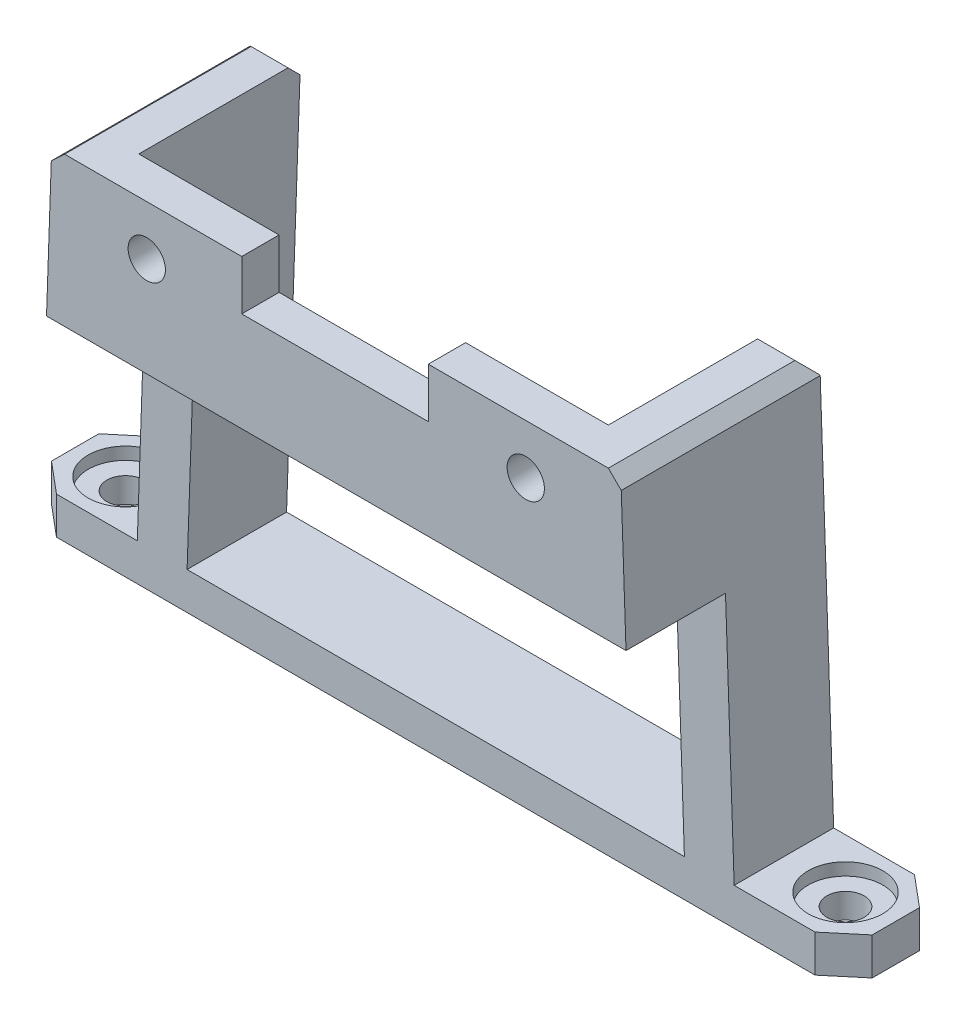
ISO-10303-21;
HEADER;
FILE_DESCRIPTION(('STEP AP214'),'2;1');
FILE_NAME('part.step','',(''),(''),'','','');
FILE_SCHEMA(('AUTOMOTIVE_DESIGN { 1 0 10303 214 1 1 1 1 }'));
ENDSEC;
DATA;
#1=APPLICATION_CONTEXT('core data for automotive mechanical design processes');
#2=APPLICATION_PROTOCOL_DEFINITION('international standard','automotive_design',2000,#1);
#3=PRODUCT_CONTEXT('',#1,'mechanical');
#4=PRODUCT('Part','Part','',(#3));
#5=PRODUCT_RELATED_PRODUCT_CATEGORY('part','',(#4));
#6=PRODUCT_DEFINITION_FORMATION('','',#4);
#7=PRODUCT_DEFINITION_CONTEXT('part definition',#1,'design');
#8=PRODUCT_DEFINITION('design','',#6,#7);
#9=PRODUCT_DEFINITION_SHAPE('','',#8);
#10=(LENGTH_UNIT() NAMED_UNIT(*) SI_UNIT(.MILLI.,.METRE.));
#11=(NAMED_UNIT(*) PLANE_ANGLE_UNIT() SI_UNIT($,.RADIAN.));
#12=(NAMED_UNIT(*) SI_UNIT($,.STERADIAN.) SOLID_ANGLE_UNIT());
#13=UNCERTAINTY_MEASURE_WITH_UNIT(LENGTH_MEASURE(1.E-05),#10,'distance_accuracy_value','');
#14=(GEOMETRIC_REPRESENTATION_CONTEXT(3) GLOBAL_UNCERTAINTY_ASSIGNED_CONTEXT((#13)) GLOBAL_UNIT_ASSIGNED_CONTEXT((#10,
#11,#12)) REPRESENTATION_CONTEXT('',''));
#15=CARTESIAN_POINT('',(0.,0.,0.));
#16=DIRECTION('',(0.,0.,1.));
#17=DIRECTION('',(1.,0.,0.));
#18=AXIS2_PLACEMENT_3D('',#15,#16,#17);
#19=CARTESIAN_POINT('',(-7.60000000000001,35.,-11.52417469626));
#20=DIRECTION('',(-1.,0.,0.));
#21=DIRECTION('',(0.,-1.,0.));
#22=AXIS2_PLACEMENT_3D('',#19,#20,#21);
#23=PLANE('',#22);
#24=DIRECTION('',(0.,-1.,0.));
#25=VECTOR('',#24,1.);
#26=CARTESIAN_POINT('',(-7.60000000000001,35.,9.));
#27=LINE('',#26,#25);
#28=CARTESIAN_POINT('',(-7.60000000000001,35.,9.));
#29=VERTEX_POINT('',#28);
#30=CARTESIAN_POINT('',(-7.6,31.,9.));
#31=VERTEX_POINT('',#30);
#32=EDGE_CURVE('E386',#29,#31,#27,.T.);
#33=ORIENTED_EDGE('',*,*,#32,.F.);
#34=DIRECTION('',(0.,0.,1.));
#35=VECTOR('',#34,1.);
#36=CARTESIAN_POINT('',(-7.60000000000001,35.,-11.52417469626));
#37=LINE('',#36,#35);
#38=CARTESIAN_POINT('',(-7.60000000000001,35.,12.));
#39=VERTEX_POINT('',#38);
#40=EDGE_CURVE('E406',#29,#39,#37,.T.);
#41=ORIENTED_EDGE('',*,*,#40,.T.);
#42=DIRECTION('',(0.,-1.,0.));
#43=VECTOR('',#42,1.);
#44=CARTESIAN_POINT('',(-7.60000000000001,35.,12.));
#45=LINE('',#44,#43);
#46=CARTESIAN_POINT('',(-7.6,31.,12.));
#47=VERTEX_POINT('',#46);
#48=EDGE_CURVE('E389',#39,#47,#45,.T.);
#49=ORIENTED_EDGE('',*,*,#48,.T.);
#50=DIRECTION('',(0.,0.,1.));
#51=VECTOR('',#50,1.);
#52=CARTESIAN_POINT('',(-7.6,31.,-11.52417469626));
#53=LINE('',#52,#51);
#54=EDGE_CURVE('E394',#31,#47,#53,.T.);
#55=ORIENTED_EDGE('',*,*,#54,.F.);
#56=EDGE_LOOP('',(#33,#41,#49,#55));
#57=FACE_BOUND('',#56,.T.);
#58=ADVANCED_FACE('F46',(#57),#23,.F.);
#59=CARTESIAN_POINT('',(-7.6,31.,-11.52417469626));
#60=DIRECTION('',(0.,-1.,0.));
#61=DIRECTION('',(1.,0.,0.));
#62=AXIS2_PLACEMENT_3D('',#59,#60,#61);
#63=PLANE('',#62);
#64=DIRECTION('',(1.,0.,0.));
#65=VECTOR('',#64,1.);
#66=CARTESIAN_POINT('',(-7.6,31.,9.));
#67=LINE('',#66,#65);
#68=CARTESIAN_POINT('',(7.4,31.,9.));
#69=VERTEX_POINT('',#68);
#70=EDGE_CURVE('E381',#31,#69,#67,.T.);
#71=ORIENTED_EDGE('',*,*,#70,.F.);
#72=ORIENTED_EDGE('',*,*,#54,.T.);
#73=DIRECTION('',(1.,0.,0.));
#74=VECTOR('',#73,1.);
#75=CARTESIAN_POINT('',(-7.6,31.,12.));
#76=LINE('',#75,#74);
#77=CARTESIAN_POINT('',(7.4,31.,12.));
#78=VERTEX_POINT('',#77);
#79=EDGE_CURVE('E395',#47,#78,#76,.T.);
#80=ORIENTED_EDGE('',*,*,#79,.T.);
#81=DIRECTION('',(0.,0.,1.));
#82=VECTOR('',#81,1.);
#83=CARTESIAN_POINT('',(7.4,31.,-11.52417469626));
#84=LINE('',#83,#82);
#85=EDGE_CURVE('E407',#69,#78,#84,.T.);
#86=ORIENTED_EDGE('',*,*,#85,.F.);
#87=EDGE_LOOP('',(#71,#72,#80,#86));
#88=FACE_BOUND('',#87,.T.);
#89=ADVANCED_FACE('F594',(#88),#63,.F.);
#90=CARTESIAN_POINT('',(7.4,31.,-11.52417469626));
#91=DIRECTION('',(1.,0.,0.));
#92=DIRECTION('',(0.,0.,-1.));
#93=AXIS2_PLACEMENT_3D('',#90,#91,#92);
#94=PLANE('',#93);
#95=DIRECTION('',(0.,1.,0.));
#96=VECTOR('',#95,1.);
#97=CARTESIAN_POINT('',(7.4,31.,9.));
#98=LINE('',#97,#96);
#99=CARTESIAN_POINT('',(7.4,35.,9.));
#100=VERTEX_POINT('',#99);
#101=EDGE_CURVE('E284',#69,#100,#98,.T.);
#102=ORIENTED_EDGE('',*,*,#101,.F.);
#103=ORIENTED_EDGE('',*,*,#85,.T.);
#104=DIRECTION('',(0.,1.,0.));
#105=VECTOR('',#104,1.);
#106=CARTESIAN_POINT('',(7.4,31.,12.));
#107=LINE('',#106,#105);
#108=CARTESIAN_POINT('',(7.4,35.,12.));
#109=VERTEX_POINT('',#108);
#110=EDGE_CURVE('E390',#78,#109,#107,.T.);
#111=ORIENTED_EDGE('',*,*,#110,.T.);
#112=DIRECTION('',(0.,0.,1.));
#113=VECTOR('',#112,1.);
#114=CARTESIAN_POINT('',(7.4,35.,-11.52417469626));
#115=LINE('',#114,#113);
#116=EDGE_CURVE('E402',#100,#109,#115,.T.);
#117=ORIENTED_EDGE('',*,*,#116,.F.);
#118=EDGE_LOOP('',(#102,#103,#111,#117));
#119=FACE_BOUND('',#118,.T.);
#120=ADVANCED_FACE('F600',(#119),#94,.F.);
#121=CARTESIAN_POINT('',(-22.8825353762642,35.,-36.4069962306133));
#122=DIRECTION('',(0.,1.,0.));
#123=DIRECTION('',(0.,0.,1.));
#124=AXIS2_PLACEMENT_3D('',#121,#122,#123);
#125=PLANE('',#124);
#126=DIRECTION('',(-1.,0.,0.));
#127=VECTOR('',#126,1.);
#128=CARTESIAN_POINT('',(-22.8825353762642,35.,-2.99999999999999));
#129=LINE('',#128,#127);
#130=CARTESIAN_POINT('',(-18.8800971990689,35.,-2.99999999999999));
#131=VERTEX_POINT('',#130);
#132=CARTESIAN_POINT('',(-21.8457194209857,35.,-2.99999999999999));
#133=VERTEX_POINT('',#132);
#134=EDGE_CURVE('E287',#131,#133,#129,.T.);
#135=ORIENTED_EDGE('',*,*,#134,.T.);
#136=DIRECTION('',(0.,0.,1.));
#137=VECTOR('',#136,1.);
#138=CARTESIAN_POINT('',(-21.8457194209857,35.,-36.4069962306133));
#139=LINE('',#138,#137);
#140=CARTESIAN_POINT('',(-21.8457194209857,35.,12.));
#141=VERTEX_POINT('',#140);
#142=EDGE_CURVE('E291',#133,#141,#139,.T.);
#143=ORIENTED_EDGE('',*,*,#142,.T.);
#144=DIRECTION('',(-1.,0.,0.));
#145=VECTOR('',#144,1.);
#146=CARTESIAN_POINT('',(-22.8825353762642,35.,12.));
#147=LINE('',#146,#145);
#148=EDGE_CURVE('E439',#39,#141,#147,.T.);
#149=ORIENTED_EDGE('',*,*,#148,.F.);
#150=ORIENTED_EDGE('',*,*,#40,.F.);
#151=DIRECTION('',(1.,0.,0.));
#152=VECTOR('',#151,1.);
#153=CARTESIAN_POINT('',(-18.8800971990689,35.,9.));
#154=LINE('',#153,#152);
#155=CARTESIAN_POINT('',(-18.8800971990689,35.,9.));
#156=VERTEX_POINT('',#155);
#157=EDGE_CURVE('E374',#156,#29,#154,.T.);
#158=ORIENTED_EDGE('',*,*,#157,.F.);
#159=DIRECTION('',(0.,0.,1.));
#160=VECTOR('',#159,1.);
#161=CARTESIAN_POINT('',(-18.8800971990689,35.,-36.4069962306133));
#162=LINE('',#161,#160);
#163=EDGE_CURVE('E496',#131,#156,#162,.T.);
#164=ORIENTED_EDGE('',*,*,#163,.F.);
#165=EDGE_LOOP('',(#135,#143,#149,#150,#158,#164));
#166=FACE_BOUND('',#165,.T.);
#167=ADVANCED_FACE('F648',(#166),#125,.T.);
#168=CARTESIAN_POINT('',(-28.953010595,3.,0.));
#169=DIRECTION('',(0.,-1.,0.));
#170=DIRECTION('',(0.,0.,-1.));
#171=AXIS2_PLACEMENT_3D('',#168,#169,#170);
#172=CYLINDRICAL_SURFACE('',#171,1.5);
#173=CARTESIAN_POINT('',(-28.953010595,0.,0.));
#174=DIRECTION('',(0.,1.,0.));
#175=DIRECTION('',(0.,0.,1.));
#176=AXIS2_PLACEMENT_3D('',#173,#174,#175);
#177=CIRCLE('',#176,1.5);
#178=CARTESIAN_POINT('',(-28.953010595,0.,1.5));
#179=VERTEX_POINT('',#178);
#180=EDGE_CURVE('E507',#179,#179,#177,.T.);
#181=ORIENTED_EDGE('',*,*,#180,.F.);
#182=EDGE_LOOP('',(#181));
#183=FACE_BOUND('',#182,.T.);
#184=CARTESIAN_POINT('',(-28.953010595,2.,0.));
#185=DIRECTION('',(0.,1.,0.));
#186=DIRECTION('',(0.,0.,1.));
#187=AXIS2_PLACEMENT_3D('',#184,#185,#186);
#188=CIRCLE('',#187,1.5);
#189=CARTESIAN_POINT('',(-28.953010595,2.,1.5));
#190=VERTEX_POINT('',#189);
#191=EDGE_CURVE('E278',#190,#190,#188,.T.);
#192=ORIENTED_EDGE('',*,*,#191,.T.);
#193=EDGE_LOOP('',(#192));
#194=FACE_BOUND('',#193,.T.);
#195=ADVANCED_FACE('F655',(#183,#194),#172,.F.);
#196=CARTESIAN_POINT('',(28.953010595,3.,0.));
#197=DIRECTION('',(0.,-1.,0.));
#198=DIRECTION('',(0.,0.,-1.));
#199=AXIS2_PLACEMENT_3D('',#196,#197,#198);
#200=CYLINDRICAL_SURFACE('',#199,1.5);
#201=CARTESIAN_POINT('',(28.953010595,0.,0.));
#202=DIRECTION('',(0.,1.,0.));
#203=DIRECTION('',(0.,0.,1.));
#204=AXIS2_PLACEMENT_3D('',#201,#202,#203);
#205=CIRCLE('',#204,1.5);
#206=CARTESIAN_POINT('',(28.953010595,0.,1.5));
#207=VERTEX_POINT('',#206);
#208=EDGE_CURVE('E503',#207,#207,#205,.T.);
#209=ORIENTED_EDGE('',*,*,#208,.F.);
#210=EDGE_LOOP('',(#209));
#211=FACE_BOUND('',#210,.T.);
#212=CARTESIAN_POINT('',(28.953010595,2.,0.));
#213=DIRECTION('',(0.,1.,0.));
#214=DIRECTION('',(0.,0.,1.));
#215=AXIS2_PLACEMENT_3D('',#212,#213,#214);
#216=CIRCLE('',#215,1.5);
#217=CARTESIAN_POINT('',(28.953010595,2.,1.5));
#218=VERTEX_POINT('',#217);
#219=EDGE_CURVE('E274',#218,#218,#216,.T.);
#220=ORIENTED_EDGE('',*,*,#219,.T.);
#221=EDGE_LOOP('',(#220));
#222=FACE_BOUND('',#221,.T.);
#223=ADVANCED_FACE('F652',(#211,#222),#200,.F.);
#224=CARTESIAN_POINT('',(-33.,3.,4.));
#225=DIRECTION('',(0.,0.,-1.));
#226=DIRECTION('',(-1.,0.,0.));
#227=AXIS2_PLACEMENT_3D('',#224,#225,#226);
#228=PLANE('',#227);
#229=DIRECTION('',(1.,0.,0.));
#230=VECTOR('',#229,1.);
#231=CARTESIAN_POINT('',(-33.,0.,4.));
#232=LINE('',#231,#230);
#233=CARTESIAN_POINT('',(-30.5,0.,4.));
#234=VERTEX_POINT('',#233);
#235=CARTESIAN_POINT('',(30.5,0.,4.));
#236=VERTEX_POINT('',#235);
#237=EDGE_CURVE('E252',#234,#236,#232,.T.);
#238=ORIENTED_EDGE('',*,*,#237,.T.);
#239=DIRECTION('',(0.,1.,0.));
#240=VECTOR('',#239,1.);
#241=CARTESIAN_POINT('',(30.5,-3.26351822333071,4.));
#242=LINE('',#241,#240);
#243=CARTESIAN_POINT('',(30.5,3.,4.));
#244=VERTEX_POINT('',#243);
#245=EDGE_CURVE('E553',#236,#244,#242,.T.);
#246=ORIENTED_EDGE('',*,*,#245,.T.);
#247=DIRECTION('',(1.,0.,0.));
#248=VECTOR('',#247,1.);
#249=CARTESIAN_POINT('',(-33.,3.,4.));
#250=LINE('',#249,#248);
#251=CARTESIAN_POINT('',(24.,3.,4.));
#252=VERTEX_POINT('',#251);
#253=EDGE_CURVE('E520',#252,#244,#250,.T.);
#254=ORIENTED_EDGE('',*,*,#253,.F.);
#255=DIRECTION('',(0.0348994967024968,-0.999390827019096,0.));
#256=VECTOR('',#255,1.);
#257=CARTESIAN_POINT('',(24.,3.,4.));
#258=LINE('',#257,#256);
#259=CARTESIAN_POINT('',(23.3015846101651,23.,4.));
#260=VERTEX_POINT('',#259);
#261=EDGE_CURVE('E454',#260,#252,#258,.T.);
#262=ORIENTED_EDGE('',*,*,#261,.F.);
#263=DIRECTION('',(1.,0.,0.));
#264=VECTOR('',#263,1.);
#265=CARTESIAN_POINT('',(23.3015846101651,23.,4.));
#266=LINE('',#265,#264);
#267=CARTESIAN_POINT('',(19.2991464329698,23.,4.));
#268=VERTEX_POINT('',#267);
#269=EDGE_CURVE('E288',#268,#260,#266,.T.);
#270=ORIENTED_EDGE('',*,*,#269,.F.);
#271=DIRECTION('',(-0.0348994967024967,0.999390827019096,0.));
#272=VECTOR('',#271,1.);
#273=CARTESIAN_POINT('',(18.8800971990689,35.,4.));
#274=LINE('',#273,#272);
#275=CARTESIAN_POINT('',(19.9975618228047,3.,4.));
#276=VERTEX_POINT('',#275);
#277=EDGE_CURVE('E462',#276,#268,#274,.T.);
#278=ORIENTED_EDGE('',*,*,#277,.F.);
#279=CARTESIAN_POINT('',(-19.9975618228047,3.,4.));
#280=VERTEX_POINT('',#279);
#281=EDGE_CURVE('E523',#280,#276,#250,.T.);
#282=ORIENTED_EDGE('',*,*,#281,.F.);
#283=DIRECTION('',(0.0348994967024967,0.999390827019096,0.));
#284=VECTOR('',#283,1.);
#285=CARTESIAN_POINT('',(-18.8800971990689,35.,4.));
#286=LINE('',#285,#284);
#287=CARTESIAN_POINT('',(-19.2991464329698,23.,4.));
#288=VERTEX_POINT('',#287);
#289=EDGE_CURVE('E458',#280,#288,#286,.T.);
#290=ORIENTED_EDGE('',*,*,#289,.T.);
#291=CARTESIAN_POINT('',(-23.3015846101651,23.,4.));
#292=VERTEX_POINT('',#291);
#293=EDGE_CURVE('E283',#292,#288,#266,.T.);
#294=ORIENTED_EDGE('',*,*,#293,.F.);
#295=DIRECTION('',(-0.0348994967024968,-0.999390827019096,0.));
#296=VECTOR('',#295,1.);
#297=CARTESIAN_POINT('',(-24.,3.,4.));
#298=LINE('',#297,#296);
#299=CARTESIAN_POINT('',(-24.,3.,4.));
#300=VERTEX_POINT('',#299);
#301=EDGE_CURVE('E489',#292,#300,#298,.T.);
#302=ORIENTED_EDGE('',*,*,#301,.T.);
#303=CARTESIAN_POINT('',(-30.5,3.,4.));
#304=VERTEX_POINT('',#303);
#305=EDGE_CURVE('E254',#304,#300,#250,.T.);
#306=ORIENTED_EDGE('',*,*,#305,.F.);
#307=DIRECTION('',(0.,1.,0.));
#308=VECTOR('',#307,1.);
#309=CARTESIAN_POINT('',(-30.5,-3.26351822333071,4.));
#310=LINE('',#309,#308);
#311=EDGE_CURVE('E236',#234,#304,#310,.T.);
#312=ORIENTED_EDGE('',*,*,#311,.F.);
#313=EDGE_LOOP('',(#238,#246,#254,#262,#270,#278,#282,#290,#294,#302,#306,#312));
#314=FACE_BOUND('',#313,.T.);
#315=ADVANCED_FACE('F250',(#314),#228,.F.);
#316=CARTESIAN_POINT('',(0.,3.,0.));
#317=DIRECTION('',(0.,-1.,0.));
#318=DIRECTION('',(0.,0.,-1.));
#319=AXIS2_PLACEMENT_3D('',#316,#317,#318);
#320=PLANE('',#319);
#321=CARTESIAN_POINT('',(28.953010595,3.,0.));
#322=DIRECTION('',(0.,1.,0.));
#323=DIRECTION('',(0.,0.,1.));
#324=AXIS2_PLACEMENT_3D('',#321,#322,#323);
#325=CIRCLE('',#324,3.);
#326=CARTESIAN_POINT('',(28.953010595,3.,3.));
#327=VERTEX_POINT('',#326);
#328=EDGE_CURVE('E422',#327,#327,#325,.T.);
#329=ORIENTED_EDGE('',*,*,#328,.F.);
#330=EDGE_LOOP('',(#329));
#331=FACE_BOUND('',#330,.T.);
#332=DIRECTION('',(0.,0.,-1.));
#333=VECTOR('',#332,1.);
#334=CARTESIAN_POINT('',(33.,3.,4.));
#335=LINE('',#334,#333);
#336=CARTESIAN_POINT('',(33.,3.,1.90225092205678));
#337=VERTEX_POINT('',#336);
#338=CARTESIAN_POINT('',(33.,3.,-1.90225092205678));
#339=VERTEX_POINT('',#338);
#340=EDGE_CURVE('E262',#337,#339,#335,.T.);
#341=ORIENTED_EDGE('',*,*,#340,.T.);
#342=DIRECTION('',(0.766044443118975,0.,0.642787609686543));
#343=VECTOR('',#342,1.);
#344=CARTESIAN_POINT('',(30.5,3.,-4.));
#345=LINE('',#344,#343);
#346=CARTESIAN_POINT('',(30.5,3.,-4.));
#347=VERTEX_POINT('',#346);
#348=EDGE_CURVE('E550',#347,#339,#345,.T.);
#349=ORIENTED_EDGE('',*,*,#348,.F.);
#350=DIRECTION('',(-1.,0.,0.));
#351=VECTOR('',#350,1.);
#352=CARTESIAN_POINT('',(-33.,3.,-4.));
#353=LINE('',#352,#351);
#354=CARTESIAN_POINT('',(24.,3.,-4.));
#355=VERTEX_POINT('',#354);
#356=EDGE_CURVE('E512',#347,#355,#353,.T.);
#357=ORIENTED_EDGE('',*,*,#356,.T.);
#358=DIRECTION('',(0.,0.,1.));
#359=VECTOR('',#358,1.);
#360=CARTESIAN_POINT('',(24.,3.,-36.4069962306133));
#361=LINE('',#360,#359);
#362=EDGE_CURVE('E466',#355,#252,#361,.T.);
#363=ORIENTED_EDGE('',*,*,#362,.T.);
#364=ORIENTED_EDGE('',*,*,#253,.T.);
#365=DIRECTION('',(-0.766044443118974,0.,0.642787609686544));
#366=VECTOR('',#365,1.);
#367=CARTESIAN_POINT('',(30.5,3.,4.));
#368=LINE('',#367,#366);
#369=EDGE_CURVE('E256',#337,#244,#368,.T.);
#370=ORIENTED_EDGE('',*,*,#369,.F.);
#371=EDGE_LOOP('',(#341,#349,#357,#363,#364,#370));
#372=FACE_BOUND('',#371,.T.);
#373=ADVANCED_FACE('F660',(#331,#372),#320,.F.);
#374=DIRECTION('',(0.,0.,1.));
#375=VECTOR('',#374,1.);
#376=CARTESIAN_POINT('',(19.9975618228047,3.,-36.4069962306133));
#377=LINE('',#376,#375);
#378=CARTESIAN_POINT('',(19.9975618228047,3.,-4.));
#379=VERTEX_POINT('',#378);
#380=EDGE_CURVE('E467',#379,#276,#377,.T.);
#381=ORIENTED_EDGE('',*,*,#380,.F.);
#382=CARTESIAN_POINT('',(-19.9975618228047,3.,-4.));
#383=VERTEX_POINT('',#382);
#384=EDGE_CURVE('E516',#379,#383,#353,.T.);
#385=ORIENTED_EDGE('',*,*,#384,.T.);
#386=DIRECTION('',(0.,0.,1.));
#387=VECTOR('',#386,1.);
#388=CARTESIAN_POINT('',(-19.9975618228047,3.,-36.4069962306133));
#389=LINE('',#388,#387);
#390=EDGE_CURVE('E492',#383,#280,#389,.T.);
#391=ORIENTED_EDGE('',*,*,#390,.T.);
#392=ORIENTED_EDGE('',*,*,#281,.T.);
#393=EDGE_LOOP('',(#381,#385,#391,#392));
#394=FACE_BOUND('',#393,.T.);
#395=ADVANCED_FACE('F663',(#394),#320,.F.);
#396=CARTESIAN_POINT('',(-28.953010595,3.,0.));
#397=DIRECTION('',(0.,1.,0.));
#398=DIRECTION('',(0.,0.,1.));
#399=AXIS2_PLACEMENT_3D('',#396,#397,#398);
#400=CIRCLE('',#399,3.);
#401=CARTESIAN_POINT('',(-28.953010595,3.,3.));
#402=VERTEX_POINT('',#401);
#403=EDGE_CURVE('E418',#402,#402,#400,.T.);
#404=ORIENTED_EDGE('',*,*,#403,.F.);
#405=EDGE_LOOP('',(#404));
#406=FACE_BOUND('',#405,.T.);
#407=DIRECTION('',(0.,0.,1.));
#408=VECTOR('',#407,1.);
#409=CARTESIAN_POINT('',(-33.,3.,4.));
#410=LINE('',#409,#408);
#411=CARTESIAN_POINT('',(-33.,3.,-1.90225092205678));
#412=VERTEX_POINT('',#411);
#413=CARTESIAN_POINT('',(-33.,3.,1.90225092205678));
#414=VERTEX_POINT('',#413);
#415=EDGE_CURVE('E515',#412,#414,#410,.T.);
#416=ORIENTED_EDGE('',*,*,#415,.T.);
#417=DIRECTION('',(-0.766044443118975,0.,-0.642787609686543));
#418=VECTOR('',#417,1.);
#419=CARTESIAN_POINT('',(-30.5,3.,4.));
#420=LINE('',#419,#418);
#421=EDGE_CURVE('E245',#304,#414,#420,.T.);
#422=ORIENTED_EDGE('',*,*,#421,.F.);
#423=ORIENTED_EDGE('',*,*,#305,.T.);
#424=DIRECTION('',(0.,0.,1.));
#425=VECTOR('',#424,1.);
#426=CARTESIAN_POINT('',(-24.,3.,-36.4069962306133));
#427=LINE('',#426,#425);
#428=CARTESIAN_POINT('',(-24.,3.,-4.));
#429=VERTEX_POINT('',#428);
#430=EDGE_CURVE('E485',#429,#300,#427,.T.);
#431=ORIENTED_EDGE('',*,*,#430,.F.);
#432=CARTESIAN_POINT('',(-30.5,3.,-4.));
#433=VERTEX_POINT('',#432);
#434=EDGE_CURVE('E268',#429,#433,#353,.T.);
#435=ORIENTED_EDGE('',*,*,#434,.T.);
#436=DIRECTION('',(0.766044443118974,0.,-0.642787609686544));
#437=VECTOR('',#436,1.);
#438=CARTESIAN_POINT('',(-30.5,3.,-4.));
#439=LINE('',#438,#437);
#440=EDGE_CURVE('E546',#412,#433,#439,.T.);
#441=ORIENTED_EDGE('',*,*,#440,.F.);
#442=EDGE_LOOP('',(#416,#422,#423,#431,#435,#441));
#443=FACE_BOUND('',#442,.T.);
#444=ADVANCED_FACE('F579',(#406,#443),#320,.F.);
#445=CARTESIAN_POINT('',(0.,0.,0.));
#446=DIRECTION('',(0.,-1.,0.));
#447=DIRECTION('',(0.,0.,-1.));
#448=AXIS2_PLACEMENT_3D('',#445,#446,#447);
#449=PLANE('',#448);
#450=DIRECTION('',(0.766044443118975,0.,0.642787609686543));
#451=VECTOR('',#450,1.);
#452=CARTESIAN_POINT('',(30.5,0.,-4.));
#453=LINE('',#452,#451);
#454=CARTESIAN_POINT('',(30.5,0.,-4.));
#455=VERTEX_POINT('',#454);
#456=CARTESIAN_POINT('',(33.,0.,-1.90225092205678));
#457=VERTEX_POINT('',#456);
#458=EDGE_CURVE('E73',#455,#457,#453,.T.);
#459=ORIENTED_EDGE('',*,*,#458,.T.);
#460=DIRECTION('',(0.,0.,-1.));
#461=VECTOR('',#460,1.);
#462=CARTESIAN_POINT('',(33.,0.,4.));
#463=LINE('',#462,#461);
#464=CARTESIAN_POINT('',(33.,0.,1.90225092205678));
#465=VERTEX_POINT('',#464);
#466=EDGE_CURVE('E510',#465,#457,#463,.T.);
#467=ORIENTED_EDGE('',*,*,#466,.F.);
#468=DIRECTION('',(-0.766044443118974,0.,0.642787609686544));
#469=VECTOR('',#468,1.);
#470=CARTESIAN_POINT('',(30.5,0.,4.));
#471=LINE('',#470,#469);
#472=EDGE_CURVE('E65',#465,#236,#471,.T.);
#473=ORIENTED_EDGE('',*,*,#472,.T.);
#474=ORIENTED_EDGE('',*,*,#237,.F.);
#475=DIRECTION('',(-0.766044443118975,0.,-0.642787609686543));
#476=VECTOR('',#475,1.);
#477=CARTESIAN_POINT('',(-30.5,0.,4.));
#478=LINE('',#477,#476);
#479=CARTESIAN_POINT('',(-33.,0.,1.90225092205678));
#480=VERTEX_POINT('',#479);
#481=EDGE_CURVE('E233',#234,#480,#478,.T.);
#482=ORIENTED_EDGE('',*,*,#481,.T.);
#483=DIRECTION('',(0.,0.,1.));
#484=VECTOR('',#483,1.);
#485=CARTESIAN_POINT('',(-33.,0.,4.));
#486=LINE('',#485,#484);
#487=CARTESIAN_POINT('',(-33.,0.,-1.90225092205678));
#488=VERTEX_POINT('',#487);
#489=EDGE_CURVE('E263',#488,#480,#486,.T.);
#490=ORIENTED_EDGE('',*,*,#489,.F.);
#491=DIRECTION('',(0.766044443118974,0.,-0.642787609686544));
#492=VECTOR('',#491,1.);
#493=CARTESIAN_POINT('',(-30.5,0.,-4.));
#494=LINE('',#493,#492);
#495=CARTESIAN_POINT('',(-30.5,0.,-4.));
#496=VERTEX_POINT('',#495);
#497=EDGE_CURVE('E537',#488,#496,#494,.T.);
#498=ORIENTED_EDGE('',*,*,#497,.T.);
#499=DIRECTION('',(-1.,0.,0.));
#500=VECTOR('',#499,1.);
#501=CARTESIAN_POINT('',(-33.,0.,-4.));
#502=LINE('',#501,#500);
#503=EDGE_CURVE('E270',#455,#496,#502,.T.);
#504=ORIENTED_EDGE('',*,*,#503,.F.);
#505=EDGE_LOOP('',(#459,#467,#473,#474,#482,#490,#498,#504));
#506=FACE_BOUND('',#505,.T.);
#507=ORIENTED_EDGE('',*,*,#180,.T.);
#508=EDGE_LOOP('',(#507));
#509=FACE_BOUND('',#508,.T.);
#510=ORIENTED_EDGE('',*,*,#208,.T.);
#511=EDGE_LOOP('',(#510));
#512=FACE_BOUND('',#511,.T.);
#513=ADVANCED_FACE('F258',(#506,#509,#512),#449,.T.);
#514=CARTESIAN_POINT('',(33.,3.,4.));
#515=DIRECTION('',(-1.,0.,0.));
#516=DIRECTION('',(0.,0.,1.));
#517=AXIS2_PLACEMENT_3D('',#514,#515,#516);
#518=PLANE('',#517);
#519=ORIENTED_EDGE('',*,*,#466,.T.);
#520=DIRECTION('',(0.,1.,0.));
#521=VECTOR('',#520,1.);
#522=CARTESIAN_POINT('',(33.,-3.26351822333071,-1.90225092205678));
#523=LINE('',#522,#521);
#524=EDGE_CURVE('E556',#457,#339,#523,.T.);
#525=ORIENTED_EDGE('',*,*,#524,.T.);
#526=ORIENTED_EDGE('',*,*,#340,.F.);
#527=DIRECTION('',(0.,1.,0.));
#528=VECTOR('',#527,1.);
#529=CARTESIAN_POINT('',(33.,-3.26351822333071,1.90225092205678));
#530=LINE('',#529,#528);
#531=EDGE_CURVE('E564',#465,#337,#530,.T.);
#532=ORIENTED_EDGE('',*,*,#531,.F.);
#533=EDGE_LOOP('',(#519,#525,#526,#532));
#534=FACE_BOUND('',#533,.T.);
#535=ADVANCED_FACE('F667',(#534),#518,.F.);
#536=CARTESIAN_POINT('',(-33.,3.,-4.));
#537=DIRECTION('',(0.,0.,1.));
#538=DIRECTION('',(1.,0.,0.));
#539=AXIS2_PLACEMENT_3D('',#536,#537,#538);
#540=PLANE('',#539);
#541=ORIENTED_EDGE('',*,*,#356,.F.);
#542=DIRECTION('',(0.,1.,0.));
#543=VECTOR('',#542,1.);
#544=CARTESIAN_POINT('',(30.5,-3.26351822333071,-4.));
#545=LINE('',#544,#543);
#546=EDGE_CURVE('E535',#455,#347,#545,.T.);
#547=ORIENTED_EDGE('',*,*,#546,.F.);
#548=ORIENTED_EDGE('',*,*,#503,.T.);
#549=DIRECTION('',(0.,1.,0.));
#550=VECTOR('',#549,1.);
#551=CARTESIAN_POINT('',(-30.5,-3.26351822333071,-4.));
#552=LINE('',#551,#550);
#553=EDGE_CURVE('E362',#496,#433,#552,.T.);
#554=ORIENTED_EDGE('',*,*,#553,.T.);
#555=ORIENTED_EDGE('',*,*,#434,.F.);
#556=DIRECTION('',(0.0348994967024968,0.999390827019096,0.));
#557=VECTOR('',#556,1.);
#558=CARTESIAN_POINT('',(-24.,3.,-4.));
#559=LINE('',#558,#557);
#560=CARTESIAN_POINT('',(-22.9174561457559,34.,-4.));
#561=VERTEX_POINT('',#560);
#562=EDGE_CURVE('E480',#429,#561,#559,.T.);
#563=ORIENTED_EDGE('',*,*,#562,.T.);
#564=DIRECTION('',(1.,0.,0.));
#565=VECTOR('',#564,1.);
#566=CARTESIAN_POINT('',(-18.8800971990689,34.,-4.));
#567=LINE('',#566,#565);
#568=CARTESIAN_POINT('',(-18.9150179685607,34.,-4.));
#569=VERTEX_POINT('',#568);
#570=EDGE_CURVE('E313',#561,#569,#567,.T.);
#571=ORIENTED_EDGE('',*,*,#570,.T.);
#572=DIRECTION('',(-0.0348994967024967,-0.999390827019096,0.));
#573=VECTOR('',#572,1.);
#574=CARTESIAN_POINT('',(-18.8800971990689,35.,-4.));
#575=LINE('',#574,#573);
#576=EDGE_CURVE('E484',#569,#383,#575,.T.);
#577=ORIENTED_EDGE('',*,*,#576,.T.);
#578=ORIENTED_EDGE('',*,*,#384,.F.);
#579=DIRECTION('',(0.0348994967024967,-0.999390827019096,0.));
#580=VECTOR('',#579,1.);
#581=CARTESIAN_POINT('',(18.8800971990689,35.,-4.));
#582=LINE('',#581,#580);
#583=CARTESIAN_POINT('',(18.9150179685607,34.,-4.));
#584=VERTEX_POINT('',#583);
#585=EDGE_CURVE('E455',#584,#379,#582,.T.);
#586=ORIENTED_EDGE('',*,*,#585,.F.);
#587=DIRECTION('',(1.,0.,0.));
#588=VECTOR('',#587,1.);
#589=CARTESIAN_POINT('',(22.8825353762642,34.,-4.));
#590=LINE('',#589,#588);
#591=CARTESIAN_POINT('',(22.8825353762642,34.,-4.));
#592=VERTEX_POINT('',#591);
#593=EDGE_CURVE('E310',#584,#592,#590,.T.);
#594=ORIENTED_EDGE('',*,*,#593,.T.);
#595=DIRECTION('',(0.707106781186554,-0.707106781186542,0.));
#596=VECTOR('',#595,1.);
#597=CARTESIAN_POINT('',(22.9187197312765,33.9638156449877,-4.));
#598=LINE('',#597,#596);
#599=CARTESIAN_POINT('',(22.9187197312765,33.9638156449877,-4.));
#600=VERTEX_POINT('',#599);
#601=EDGE_CURVE('E307',#592,#600,#598,.T.);
#602=ORIENTED_EDGE('',*,*,#601,.T.);
#603=DIRECTION('',(-0.0348994967024968,0.999390827019096,0.));
#604=VECTOR('',#603,1.);
#605=CARTESIAN_POINT('',(24.,3.,-4.));
#606=LINE('',#605,#604);
#607=EDGE_CURVE('E459',#355,#600,#606,.T.);
#608=ORIENTED_EDGE('',*,*,#607,.F.);
#609=EDGE_LOOP('',(#541,#547,#548,#554,#555,#563,#571,#577,#578,#586,#594,#602,#608));
#610=FACE_BOUND('',#609,.T.);
#611=ADVANCED_FACE('F532',(#610),#540,.F.);
#612=CARTESIAN_POINT('',(-33.,3.,4.));
#613=DIRECTION('',(1.,0.,0.));
#614=DIRECTION('',(0.,0.,-1.));
#615=AXIS2_PLACEMENT_3D('',#612,#613,#614);
#616=PLANE('',#615);
#617=ORIENTED_EDGE('',*,*,#489,.T.);
#618=DIRECTION('',(0.,1.,0.));
#619=VECTOR('',#618,1.);
#620=CARTESIAN_POINT('',(-33.,-3.26351822333071,1.90225092205678));
#621=LINE('',#620,#619);
#622=EDGE_CURVE('E239',#480,#414,#621,.T.);
#623=ORIENTED_EDGE('',*,*,#622,.T.);
#624=ORIENTED_EDGE('',*,*,#415,.F.);
#625=DIRECTION('',(0.,1.,0.));
#626=VECTOR('',#625,1.);
#627=CARTESIAN_POINT('',(-33.,-3.26351822333071,-1.90225092205678));
#628=LINE('',#627,#626);
#629=EDGE_CURVE('E541',#488,#412,#628,.T.);
#630=ORIENTED_EDGE('',*,*,#629,.F.);
#631=EDGE_LOOP('',(#617,#623,#624,#630));
#632=FACE_BOUND('',#631,.T.);
#633=ADVANCED_FACE('F576',(#632),#616,.F.);
#634=CARTESIAN_POINT('',(-24.,3.,-36.4069962306133));
#635=DIRECTION('',(-0.999390827019096,0.0348994967024968,0.));
#636=DIRECTION('',(-0.0348994967024968,-0.999390827019096,0.));
#637=AXIS2_PLACEMENT_3D('',#634,#635,#636);
#638=PLANE('',#637);
#639=DIRECTION('',(-0.0348994967024966,-0.999390827019096,0.));
#640=VECTOR('',#639,1.);
#641=CARTESIAN_POINT('',(-23.3015846101651,23.,12.));
#642=LINE('',#641,#640);
#643=CARTESIAN_POINT('',(-22.9174348729667,34.0006091729809,12.));
#644=VERTEX_POINT('',#643);
#645=CARTESIAN_POINT('',(-23.3015846101651,23.,12.));
#646=VERTEX_POINT('',#645);
#647=EDGE_CURVE('E429',#644,#646,#642,.T.);
#648=ORIENTED_EDGE('',*,*,#647,.F.);
#649=DIRECTION('',(0.,0.,-1.));
#650=VECTOR('',#649,1.);
#651=CARTESIAN_POINT('',(-22.9174348729667,34.0006091729809,-36.4069962306133));
#652=LINE('',#651,#650);
#653=CARTESIAN_POINT('',(-22.9174348729667,34.0006091729809,-3.9993908270191));
#654=VERTEX_POINT('',#653);
#655=EDGE_CURVE('E304',#644,#654,#652,.T.);
#656=ORIENTED_EDGE('',*,*,#655,.T.);
#657=DIRECTION('',(-0.0246851884078287,-0.70689130758316,-0.706891307583167));
#658=VECTOR('',#657,1.);
#659=CARTESIAN_POINT('',(-24.0245517255971,2.29693056726863,-35.7030694327317));
#660=LINE('',#659,#658);
#661=EDGE_CURVE('E301',#654,#561,#660,.T.);
#662=ORIENTED_EDGE('',*,*,#661,.T.);
#663=ORIENTED_EDGE('',*,*,#562,.F.);
#664=ORIENTED_EDGE('',*,*,#430,.T.);
#665=ORIENTED_EDGE('',*,*,#301,.F.);
#666=DIRECTION('',(0.,0.,-1.));
#667=VECTOR('',#666,1.);
#668=CARTESIAN_POINT('',(-23.3015846101651,23.,12.));
#669=LINE('',#668,#667);
#670=EDGE_CURVE('E450',#646,#292,#669,.T.);
#671=ORIENTED_EDGE('',*,*,#670,.F.);
#672=EDGE_LOOP('',(#648,#656,#662,#663,#664,#665,#671));
#673=FACE_BOUND('',#672,.T.);
#674=ADVANCED_FACE('F640',(#673),#638,.T.);
#675=DIRECTION('',(0.,0.,-1.));
#676=VECTOR('',#675,1.);
#677=CARTESIAN_POINT('',(21.8825353762642,35.,-4.));
#678=LINE('',#677,#676);
#679=CARTESIAN_POINT('',(21.8825353762642,35.,12.));
#680=VERTEX_POINT('',#679);
#681=CARTESIAN_POINT('',(21.8825353762642,35.,-3.));
#682=VERTEX_POINT('',#681);
#683=EDGE_CURVE('E319',#680,#682,#678,.T.);
#684=ORIENTED_EDGE('',*,*,#683,.T.);
#685=DIRECTION('',(-1.,0.,0.));
#686=VECTOR('',#685,1.);
#687=CARTESIAN_POINT('',(18.8800971990689,35.,-3.));
#688=LINE('',#687,#686);
#689=CARTESIAN_POINT('',(18.8800971990689,35.,-3.));
#690=VERTEX_POINT('',#689);
#691=EDGE_CURVE('E322',#682,#690,#688,.T.);
#692=ORIENTED_EDGE('',*,*,#691,.T.);
#693=DIRECTION('',(0.,0.,1.));
#694=VECTOR('',#693,1.);
#695=CARTESIAN_POINT('',(18.8800971990689,35.,-36.4069962306133));
#696=LINE('',#695,#694);
#697=CARTESIAN_POINT('',(18.8800971990689,35.,9.));
#698=VERTEX_POINT('',#697);
#699=EDGE_CURVE('E471',#690,#698,#696,.T.);
#700=ORIENTED_EDGE('',*,*,#699,.T.);
#701=EDGE_CURVE('E373',#100,#698,#154,.T.);
#702=ORIENTED_EDGE('',*,*,#701,.F.);
#703=ORIENTED_EDGE('',*,*,#116,.T.);
#704=EDGE_CURVE('E440',#680,#109,#147,.T.);
#705=ORIENTED_EDGE('',*,*,#704,.F.);
#706=EDGE_LOOP('',(#684,#692,#700,#702,#703,#705));
#707=FACE_BOUND('',#706,.T.);
#708=ADVANCED_FACE('F643',(#707),#125,.T.);
#709=CARTESIAN_POINT('',(-18.8800971990689,35.,-36.4069962306133));
#710=DIRECTION('',(0.999390827019096,-0.0348994967024967,0.));
#711=DIRECTION('',(0.0348994967024967,0.999390827019096,0.));
#712=AXIS2_PLACEMENT_3D('',#709,#710,#711);
#713=PLANE('',#712);
#714=ORIENTED_EDGE('',*,*,#576,.F.);
#715=DIRECTION('',(0.0246851884078287,0.70689130758316,0.706891307583167));
#716=VECTOR('',#715,1.);
#717=CARTESIAN_POINT('',(-19.4630407682355,18.3066803036962,-19.693319696304));
#718=LINE('',#717,#716);
#719=EDGE_CURVE('E316',#569,#131,#718,.T.);
#720=ORIENTED_EDGE('',*,*,#719,.T.);
#721=ORIENTED_EDGE('',*,*,#163,.T.);
#722=DIRECTION('',(0.0348994967024966,0.999390827019096,0.));
#723=VECTOR('',#722,1.);
#724=CARTESIAN_POINT('',(-19.2991464329698,23.,9.));
#725=LINE('',#724,#723);
#726=CARTESIAN_POINT('',(-19.2991464329698,23.,9.));
#727=VERTEX_POINT('',#726);
#728=EDGE_CURVE('E369',#727,#156,#725,.T.);
#729=ORIENTED_EDGE('',*,*,#728,.F.);
#730=DIRECTION('',(0.,0.,-1.));
#731=VECTOR('',#730,1.);
#732=CARTESIAN_POINT('',(-19.2991464329698,23.,9.));
#733=LINE('',#732,#731);
#734=EDGE_CURVE('E378',#727,#288,#733,.T.);
#735=ORIENTED_EDGE('',*,*,#734,.T.);
#736=ORIENTED_EDGE('',*,*,#289,.F.);
#737=ORIENTED_EDGE('',*,*,#390,.F.);
#738=EDGE_LOOP('',(#714,#720,#721,#729,#735,#736,#737));
#739=FACE_BOUND('',#738,.T.);
#740=ADVANCED_FACE('F638',(#739),#713,.T.);
#741=CARTESIAN_POINT('',(24.,3.,-36.4069962306133));
#742=DIRECTION('',(-0.999390827019096,-0.0348994967024968,0.));
#743=DIRECTION('',(0.0348994967024968,-0.999390827019096,0.));
#744=AXIS2_PLACEMENT_3D('',#741,#742,#743);
#745=PLANE('',#744);
#746=ORIENTED_EDGE('',*,*,#607,.T.);
#747=DIRECTION('',(0.,0.,1.));
#748=VECTOR('',#747,1.);
#749=CARTESIAN_POINT('',(22.9187197312765,33.9638156449877,12.));
#750=LINE('',#749,#748);
#751=CARTESIAN_POINT('',(22.9187197312765,33.9638156449877,12.));
#752=VERTEX_POINT('',#751);
#753=EDGE_CURVE('E11',#600,#752,#750,.T.);
#754=ORIENTED_EDGE('',*,*,#753,.T.);
#755=DIRECTION('',(-0.0348994967024969,0.999390827019096,0.));
#756=VECTOR('',#755,1.);
#757=CARTESIAN_POINT('',(22.8825353762642,35.,12.));
#758=LINE('',#757,#756);
#759=CARTESIAN_POINT('',(23.3015846101651,23.,12.));
#760=VERTEX_POINT('',#759);
#761=EDGE_CURVE('E435',#760,#752,#758,.T.);
#762=ORIENTED_EDGE('',*,*,#761,.F.);
#763=DIRECTION('',(0.,0.,-1.));
#764=VECTOR('',#763,1.);
#765=CARTESIAN_POINT('',(23.3015846101651,23.,12.));
#766=LINE('',#765,#764);
#767=EDGE_CURVE('E443',#760,#260,#766,.T.);
#768=ORIENTED_EDGE('',*,*,#767,.T.);
#769=ORIENTED_EDGE('',*,*,#261,.T.);
#770=ORIENTED_EDGE('',*,*,#362,.F.);
#771=EDGE_LOOP('',(#746,#754,#762,#768,#769,#770));
#772=FACE_BOUND('',#771,.T.);
#773=ADVANCED_FACE('F634',(#772),#745,.F.);
#774=CARTESIAN_POINT('',(18.8800971990689,35.,-36.4069962306133));
#775=DIRECTION('',(0.999390827019096,0.0348994967024967,0.));
#776=DIRECTION('',(-0.0348994967024967,0.999390827019096,0.));
#777=AXIS2_PLACEMENT_3D('',#774,#775,#776);
#778=PLANE('',#777);
#779=ORIENTED_EDGE('',*,*,#699,.F.);
#780=DIRECTION('',(0.0246851884078287,-0.706891307583163,-0.706891307583165));
#781=VECTOR('',#780,1.);
#782=CARTESIAN_POINT('',(18.8546487828104,35.7287472936267,-2.27125270637326));
#783=LINE('',#782,#781);
#784=EDGE_CURVE('E57',#690,#584,#783,.T.);
#785=ORIENTED_EDGE('',*,*,#784,.T.);
#786=ORIENTED_EDGE('',*,*,#585,.T.);
#787=ORIENTED_EDGE('',*,*,#380,.T.);
#788=ORIENTED_EDGE('',*,*,#277,.T.);
#789=DIRECTION('',(0.,0.,-1.));
#790=VECTOR('',#789,1.);
#791=CARTESIAN_POINT('',(19.2991464329698,23.,9.));
#792=LINE('',#791,#790);
#793=CARTESIAN_POINT('',(19.2991464329698,23.,9.));
#794=VERTEX_POINT('',#793);
#795=EDGE_CURVE('E377',#794,#268,#792,.T.);
#796=ORIENTED_EDGE('',*,*,#795,.F.);
#797=DIRECTION('',(0.0348994967024966,-0.999390827019096,0.));
#798=VECTOR('',#797,1.);
#799=CARTESIAN_POINT('',(18.8800971990689,35.,9.));
#800=LINE('',#799,#798);
#801=EDGE_CURVE('E330',#698,#794,#800,.T.);
#802=ORIENTED_EDGE('',*,*,#801,.F.);
#803=EDGE_LOOP('',(#779,#785,#786,#787,#788,#796,#802));
#804=FACE_BOUND('',#803,.T.);
#805=ADVANCED_FACE('F630',(#804),#778,.F.);
#806=CARTESIAN_POINT('',(23.3015846101651,23.,12.));
#807=DIRECTION('',(0.,1.,0.));
#808=DIRECTION('',(-1.,0.,0.));
#809=AXIS2_PLACEMENT_3D('',#806,#807,#808);
#810=PLANE('',#809);
#811=DIRECTION('',(-1.,0.,0.));
#812=VECTOR('',#811,1.);
#813=CARTESIAN_POINT('',(19.2991464329698,23.,9.));
#814=LINE('',#813,#812);
#815=EDGE_CURVE('E338',#794,#727,#814,.T.);
#816=ORIENTED_EDGE('',*,*,#815,.F.);
#817=ORIENTED_EDGE('',*,*,#795,.T.);
#818=ORIENTED_EDGE('',*,*,#269,.T.);
#819=ORIENTED_EDGE('',*,*,#767,.F.);
#820=DIRECTION('',(1.,0.,0.));
#821=VECTOR('',#820,1.);
#822=CARTESIAN_POINT('',(23.3015846101651,23.,12.));
#823=LINE('',#822,#821);
#824=EDGE_CURVE('E432',#646,#760,#823,.T.);
#825=ORIENTED_EDGE('',*,*,#824,.F.);
#826=ORIENTED_EDGE('',*,*,#670,.T.);
#827=ORIENTED_EDGE('',*,*,#293,.T.);
#828=ORIENTED_EDGE('',*,*,#734,.F.);
#829=EDGE_LOOP('',(#816,#817,#818,#819,#825,#826,#827,#828));
#830=FACE_BOUND('',#829,.T.);
#831=ADVANCED_FACE('F626',(#830),#810,.F.);
#832=CARTESIAN_POINT('',(0.,0.,12.));
#833=DIRECTION('',(0.,0.,-1.));
#834=DIRECTION('',(-1.,0.,0.));
#835=AXIS2_PLACEMENT_3D('',#832,#833,#834);
#836=PLANE('',#835);
#837=CARTESIAN_POINT('',(15.24,31.,12.));
#838=DIRECTION('',(0.,0.,-1.));
#839=DIRECTION('',(-1.,0.,0.));
#840=AXIS2_PLACEMENT_3D('',#837,#838,#839);
#841=CIRCLE('',#840,1.5);
#842=CARTESIAN_POINT('',(13.74,31.,12.));
#843=VERTEX_POINT('',#842);
#844=EDGE_CURVE('E341',#843,#843,#841,.F.);
#845=ORIENTED_EDGE('',*,*,#844,.F.);
#846=EDGE_LOOP('',(#845));
#847=FACE_BOUND('',#846,.T.);
#848=CARTESIAN_POINT('',(-15.24,31.,12.));
#849=DIRECTION('',(0.,0.,-1.));
#850=DIRECTION('',(-1.,0.,0.));
#851=AXIS2_PLACEMENT_3D('',#848,#849,#850);
#852=CIRCLE('',#851,1.5);
#853=CARTESIAN_POINT('',(-16.74,31.,12.));
#854=VERTEX_POINT('',#853);
#855=EDGE_CURVE('E358',#854,#854,#852,.F.);
#856=ORIENTED_EDGE('',*,*,#855,.F.);
#857=EDGE_LOOP('',(#856));
#858=FACE_BOUND('',#857,.T.);
#859=ORIENTED_EDGE('',*,*,#148,.T.);
#860=DIRECTION('',(0.731353701619166,0.681998360062503,0.));
#861=VECTOR('',#860,1.);
#862=CARTESIAN_POINT('',(-21.8457194209857,35.,12.));
#863=LINE('',#862,#861);
#864=EDGE_CURVE('E298',#141,#644,#863,.F.);
#865=ORIENTED_EDGE('',*,*,#864,.T.);
#866=ORIENTED_EDGE('',*,*,#647,.T.);
#867=ORIENTED_EDGE('',*,*,#824,.T.);
#868=ORIENTED_EDGE('',*,*,#761,.T.);
#869=DIRECTION('',(-0.707106781186554,0.707106781186542,0.));
#870=VECTOR('',#869,1.);
#871=CARTESIAN_POINT('',(22.9187197312765,33.9638156449877,12.));
#872=LINE('',#871,#870);
#873=EDGE_CURVE('E295',#752,#680,#872,.T.);
#874=ORIENTED_EDGE('',*,*,#873,.T.);
#875=ORIENTED_EDGE('',*,*,#704,.T.);
#876=ORIENTED_EDGE('',*,*,#110,.F.);
#877=ORIENTED_EDGE('',*,*,#79,.F.);
#878=ORIENTED_EDGE('',*,*,#48,.F.);
#879=EDGE_LOOP('',(#859,#865,#866,#867,#868,#874,#875,#876,#877,#878));
#880=FACE_BOUND('',#879,.T.);
#881=ADVANCED_FACE('F619',(#847,#858,#880),#836,.F.);
#882=CARTESIAN_POINT('',(28.953010595,2.,0.));
#883=DIRECTION('',(0.,1.,0.));
#884=DIRECTION('',(0.,0.,1.));
#885=AXIS2_PLACEMENT_3D('',#882,#883,#884);
#886=CYLINDRICAL_SURFACE('',#885,3.);
#887=CARTESIAN_POINT('',(28.953010595,2.,0.));
#888=DIRECTION('',(0.,1.,0.));
#889=DIRECTION('',(0.,0.,1.));
#890=AXIS2_PLACEMENT_3D('',#887,#888,#889);
#891=CIRCLE('',#890,3.);
#892=CARTESIAN_POINT('',(28.953010595,2.,3.));
#893=VERTEX_POINT('',#892);
#894=EDGE_CURVE('E414',#893,#893,#891,.T.);
#895=ORIENTED_EDGE('',*,*,#894,.F.);
#896=EDGE_LOOP('',(#895));
#897=FACE_BOUND('',#896,.T.);
#898=ORIENTED_EDGE('',*,*,#328,.T.);
#899=EDGE_LOOP('',(#898));
#900=FACE_BOUND('',#899,.T.);
#901=ADVANCED_FACE('F616',(#897,#900),#886,.F.);
#902=CARTESIAN_POINT('',(28.953010595,2.,0.));
#903=DIRECTION('',(0.,1.,0.));
#904=DIRECTION('',(0.,0.,1.));
#905=AXIS2_PLACEMENT_3D('',#902,#903,#904);
#906=PLANE('',#905);
#907=ORIENTED_EDGE('',*,*,#219,.F.);
#908=EDGE_LOOP('',(#907));
#909=FACE_BOUND('',#908,.T.);
#910=ORIENTED_EDGE('',*,*,#894,.T.);
#911=EDGE_LOOP('',(#910));
#912=FACE_BOUND('',#911,.T.);
#913=ADVANCED_FACE('F614',(#909,#912),#906,.T.);
#914=CARTESIAN_POINT('',(-28.953010595,2.,0.));
#915=DIRECTION('',(0.,1.,0.));
#916=DIRECTION('',(0.,0.,1.));
#917=AXIS2_PLACEMENT_3D('',#914,#915,#916);
#918=CYLINDRICAL_SURFACE('',#917,3.);
#919=CARTESIAN_POINT('',(-28.953010595,2.,0.));
#920=DIRECTION('',(0.,1.,0.));
#921=DIRECTION('',(0.,0.,1.));
#922=AXIS2_PLACEMENT_3D('',#919,#920,#921);
#923=CIRCLE('',#922,3.);
#924=CARTESIAN_POINT('',(-28.953010595,2.,3.));
#925=VERTEX_POINT('',#924);
#926=EDGE_CURVE('E279',#925,#925,#923,.T.);
#927=ORIENTED_EDGE('',*,*,#926,.F.);
#928=EDGE_LOOP('',(#927));
#929=FACE_BOUND('',#928,.T.);
#930=ORIENTED_EDGE('',*,*,#403,.T.);
#931=EDGE_LOOP('',(#930));
#932=FACE_BOUND('',#931,.T.);
#933=ADVANCED_FACE('F610',(#929,#932),#918,.F.);
#934=CARTESIAN_POINT('',(-28.953010595,2.,0.));
#935=DIRECTION('',(0.,1.,0.));
#936=DIRECTION('',(0.,0.,1.));
#937=AXIS2_PLACEMENT_3D('',#934,#935,#936);
#938=PLANE('',#937);
#939=ORIENTED_EDGE('',*,*,#191,.F.);
#940=EDGE_LOOP('',(#939));
#941=FACE_BOUND('',#940,.T.);
#942=ORIENTED_EDGE('',*,*,#926,.T.);
#943=EDGE_LOOP('',(#942));
#944=FACE_BOUND('',#943,.T.);
#945=ADVANCED_FACE('F606',(#941,#944),#938,.T.);
#946=CARTESIAN_POINT('',(0.,0.,9.));
#947=DIRECTION('',(0.,0.,-1.));
#948=DIRECTION('',(-1.,0.,0.));
#949=AXIS2_PLACEMENT_3D('',#946,#947,#948);
#950=PLANE('',#949);
#951=CARTESIAN_POINT('',(15.24,31.,9.));
#952=DIRECTION('',(0.,0.,-1.));
#953=DIRECTION('',(-1.,0.,0.));
#954=AXIS2_PLACEMENT_3D('',#951,#952,#953);
#955=CIRCLE('',#954,1.5);
#956=CARTESIAN_POINT('',(13.74,31.,9.));
#957=VERTEX_POINT('',#956);
#958=EDGE_CURVE('E348',#957,#957,#955,.T.);
#959=ORIENTED_EDGE('',*,*,#958,.F.);
#960=EDGE_LOOP('',(#959));
#961=FACE_BOUND('',#960,.T.);
#962=CARTESIAN_POINT('',(-15.24,31.,9.));
#963=DIRECTION('',(0.,0.,-1.));
#964=DIRECTION('',(-1.,0.,0.));
#965=AXIS2_PLACEMENT_3D('',#962,#963,#964);
#966=CIRCLE('',#965,1.5);
#967=CARTESIAN_POINT('',(-16.74,31.,9.));
#968=VERTEX_POINT('',#967);
#969=EDGE_CURVE('E354',#968,#968,#966,.T.);
#970=ORIENTED_EDGE('',*,*,#969,.F.);
#971=EDGE_LOOP('',(#970));
#972=FACE_BOUND('',#971,.T.);
#973=ORIENTED_EDGE('',*,*,#32,.T.);
#974=ORIENTED_EDGE('',*,*,#70,.T.);
#975=ORIENTED_EDGE('',*,*,#101,.T.);
#976=ORIENTED_EDGE('',*,*,#701,.T.);
#977=ORIENTED_EDGE('',*,*,#801,.T.);
#978=ORIENTED_EDGE('',*,*,#815,.T.);
#979=ORIENTED_EDGE('',*,*,#728,.T.);
#980=ORIENTED_EDGE('',*,*,#157,.T.);
#981=EDGE_LOOP('',(#973,#974,#975,#976,#977,#978,#979,#980));
#982=FACE_BOUND('',#981,.T.);
#983=ADVANCED_FACE('F609',(#961,#972,#982),#950,.T.);
#984=CARTESIAN_POINT('',(-33.,34.,-4.));
#985=DIRECTION('',(0.,0.707106781186551,-0.707106781186544));
#986=DIRECTION('',(-1.,0.,0.));
#987=AXIS2_PLACEMENT_3D('',#984,#985,#986);
#988=PLANE('',#987);
#989=ORIENTED_EDGE('',*,*,#570,.F.);
#990=ORIENTED_EDGE('',*,*,#661,.F.);
#991=DIRECTION('',(-0.604213749832968,-0.563438436971057,-0.563438436971063));
#992=VECTOR('',#991,1.);
#993=CARTESIAN_POINT('',(-26.5987346004695,30.56774164049,-7.43225835951002));
#994=LINE('',#993,#992);
#995=EDGE_CURVE('E327',#133,#654,#994,.T.);
#996=ORIENTED_EDGE('',*,*,#995,.F.);
#997=ORIENTED_EDGE('',*,*,#134,.F.);
#998=ORIENTED_EDGE('',*,*,#719,.F.);
#999=EDGE_LOOP('',(#989,#990,#996,#997,#998));
#1000=FACE_BOUND('',#999,.T.);
#1001=ADVANCED_FACE('F684',(#1000),#988,.T.);
#1002=CARTESIAN_POINT('',(-21.8457194209857,35.,-36.4069962306133));
#1003=DIRECTION('',(0.681998360062503,-0.731353701619166,0.));
#1004=DIRECTION('',(0.,0.,1.));
#1005=AXIS2_PLACEMENT_3D('',#1002,#1003,#1004);
#1006=PLANE('',#1005);
#1007=ORIENTED_EDGE('',*,*,#995,.T.);
#1008=ORIENTED_EDGE('',*,*,#655,.F.);
#1009=ORIENTED_EDGE('',*,*,#864,.F.);
#1010=ORIENTED_EDGE('',*,*,#142,.F.);
#1011=EDGE_LOOP('',(#1007,#1008,#1009,#1010));
#1012=FACE_BOUND('',#1011,.T.);
#1013=ADVANCED_FACE('F678',(#1012),#1006,.F.);
#1014=CARTESIAN_POINT('',(22.9187197312765,33.9638156449877,-36.4069962306133));
#1015=DIRECTION('',(0.707106781186542,0.707106781186554,0.));
#1016=DIRECTION('',(0.,0.,-1.));
#1017=AXIS2_PLACEMENT_3D('',#1014,#1015,#1016);
#1018=PLANE('',#1017);
#1019=ORIENTED_EDGE('',*,*,#753,.F.);
#1020=ORIENTED_EDGE('',*,*,#601,.F.);
#1021=DIRECTION('',(-0.577350269189632,0.577350269189622,0.577350269189624));
#1022=VECTOR('',#1021,1.);
#1023=CARTESIAN_POINT('',(33.7089903564769,23.1735450197875,-14.8264549802126));
#1024=LINE('',#1023,#1022);
#1025=EDGE_CURVE('E51',#682,#592,#1024,.F.);
#1026=ORIENTED_EDGE('',*,*,#1025,.F.);
#1027=ORIENTED_EDGE('',*,*,#683,.F.);
#1028=ORIENTED_EDGE('',*,*,#873,.F.);
#1029=EDGE_LOOP('',(#1019,#1020,#1026,#1027,#1028));
#1030=FACE_BOUND('',#1029,.T.);
#1031=ADVANCED_FACE('F49',(#1030),#1018,.T.);
#1032=CARTESIAN_POINT('',(-22.8825353762642,35.,-3.));
#1033=DIRECTION('',(0.,0.707106781186549,-0.707106781186546));
#1034=DIRECTION('',(1.,0.,0.));
#1035=AXIS2_PLACEMENT_3D('',#1032,#1033,#1034);
#1036=PLANE('',#1035);
#1037=ORIENTED_EDGE('',*,*,#1025,.T.);
#1038=ORIENTED_EDGE('',*,*,#593,.F.);
#1039=ORIENTED_EDGE('',*,*,#784,.F.);
#1040=ORIENTED_EDGE('',*,*,#691,.F.);
#1041=EDGE_LOOP('',(#1037,#1038,#1039,#1040));
#1042=FACE_BOUND('',#1041,.T.);
#1043=ADVANCED_FACE('F690',(#1042),#1036,.T.);
#1044=CARTESIAN_POINT('',(-15.24,31.,16.2426406871193));
#1045=DIRECTION('',(0.,0.,-1.));
#1046=DIRECTION('',(-1.,0.,0.));
#1047=AXIS2_PLACEMENT_3D('',#1044,#1045,#1046);
#1048=CYLINDRICAL_SURFACE('',#1047,1.5);
#1049=ORIENTED_EDGE('',*,*,#855,.T.);
#1050=EDGE_LOOP('',(#1049));
#1051=FACE_BOUND('',#1050,.T.);
#1052=ORIENTED_EDGE('',*,*,#969,.T.);
#1053=EDGE_LOOP('',(#1052));
#1054=FACE_BOUND('',#1053,.T.);
#1055=ADVANCED_FACE('F590',(#1051,#1054),#1048,.F.);
#1056=CARTESIAN_POINT('',(15.24,31.,16.2426406871193));
#1057=DIRECTION('',(0.,0.,-1.));
#1058=DIRECTION('',(-1.,0.,0.));
#1059=AXIS2_PLACEMENT_3D('',#1056,#1057,#1058);
#1060=CYLINDRICAL_SURFACE('',#1059,1.5);
#1061=ORIENTED_EDGE('',*,*,#844,.T.);
#1062=EDGE_LOOP('',(#1061));
#1063=FACE_BOUND('',#1062,.T.);
#1064=ORIENTED_EDGE('',*,*,#958,.T.);
#1065=EDGE_LOOP('',(#1064));
#1066=FACE_BOUND('',#1065,.T.);
#1067=ADVANCED_FACE('F582',(#1063,#1066),#1060,.F.);
#1068=CARTESIAN_POINT('',(-30.5,-3.26351822333071,-4.));
#1069=DIRECTION('',(0.642787609686544,0.,0.766044443118974));
#1070=DIRECTION('',(0.766044443118974,0.,-0.642787609686544));
#1071=AXIS2_PLACEMENT_3D('',#1068,#1069,#1070);
#1072=PLANE('',#1071);
#1073=ORIENTED_EDGE('',*,*,#629,.T.);
#1074=ORIENTED_EDGE('',*,*,#440,.T.);
#1075=ORIENTED_EDGE('',*,*,#553,.F.);
#1076=ORIENTED_EDGE('',*,*,#497,.F.);
#1077=EDGE_LOOP('',(#1073,#1074,#1075,#1076));
#1078=FACE_BOUND('',#1077,.T.);
#1079=ADVANCED_FACE('F580',(#1078),#1072,.F.);
#1080=CARTESIAN_POINT('',(-30.5,-3.26351822333071,4.));
#1081=DIRECTION('',(0.642787609686543,0.,-0.766044443118975));
#1082=DIRECTION('',(-0.766044443118975,0.,-0.642787609686543));
#1083=AXIS2_PLACEMENT_3D('',#1080,#1081,#1082);
#1084=PLANE('',#1083);
#1085=ORIENTED_EDGE('',*,*,#311,.T.);
#1086=ORIENTED_EDGE('',*,*,#421,.T.);
#1087=ORIENTED_EDGE('',*,*,#622,.F.);
#1088=ORIENTED_EDGE('',*,*,#481,.F.);
#1089=EDGE_LOOP('',(#1085,#1086,#1087,#1088));
#1090=FACE_BOUND('',#1089,.T.);
#1091=ADVANCED_FACE('F235',(#1090),#1084,.F.);
#1092=CARTESIAN_POINT('',(30.5,-3.26351822333071,-4.));
#1093=DIRECTION('',(-0.642787609686543,0.,0.766044443118975));
#1094=DIRECTION('',(0.766044443118975,0.,0.642787609686543));
#1095=AXIS2_PLACEMENT_3D('',#1092,#1093,#1094);
#1096=PLANE('',#1095);
#1097=ORIENTED_EDGE('',*,*,#546,.T.);
#1098=ORIENTED_EDGE('',*,*,#348,.T.);
#1099=ORIENTED_EDGE('',*,*,#524,.F.);
#1100=ORIENTED_EDGE('',*,*,#458,.F.);
#1101=EDGE_LOOP('',(#1097,#1098,#1099,#1100));
#1102=FACE_BOUND('',#1101,.T.);
#1103=ADVANCED_FACE('F588',(#1102),#1096,.F.);
#1104=CARTESIAN_POINT('',(30.5,-3.26351822333071,4.));
#1105=DIRECTION('',(-0.642787609686544,0.,-0.766044443118974));
#1106=DIRECTION('',(-0.766044443118974,0.,0.642787609686544));
#1107=AXIS2_PLACEMENT_3D('',#1104,#1105,#1106);
#1108=PLANE('',#1107);
#1109=ORIENTED_EDGE('',*,*,#531,.T.);
#1110=ORIENTED_EDGE('',*,*,#369,.T.);
#1111=ORIENTED_EDGE('',*,*,#245,.F.);
#1112=ORIENTED_EDGE('',*,*,#472,.F.);
#1113=EDGE_LOOP('',(#1109,#1110,#1111,#1112));
#1114=FACE_BOUND('',#1113,.T.);
#1115=ADVANCED_FACE('F833',(#1114),#1108,.F.);
#1116=CLOSED_SHELL('',(#58,#89,#120,#167,#195,#223,#315,#373,#395,#444,#513,#535,#611,#633,#674,
#708,#740,#773,#805,#831,#881,#901,#913,#933,#945,#983,#1001,#1013,#1031,#1043,#1055,#1067,
#1079,#1091,#1103,#1115));
#1117=MANIFOLD_SOLID_BREP('B2',#1116);
#1118=ADVANCED_BREP_SHAPE_REPRESENTATION('',(#18,#1117),#14);
#1119=SHAPE_DEFINITION_REPRESENTATION(#9,#1118);
ENDSEC;
END-ISO-10303-21;
